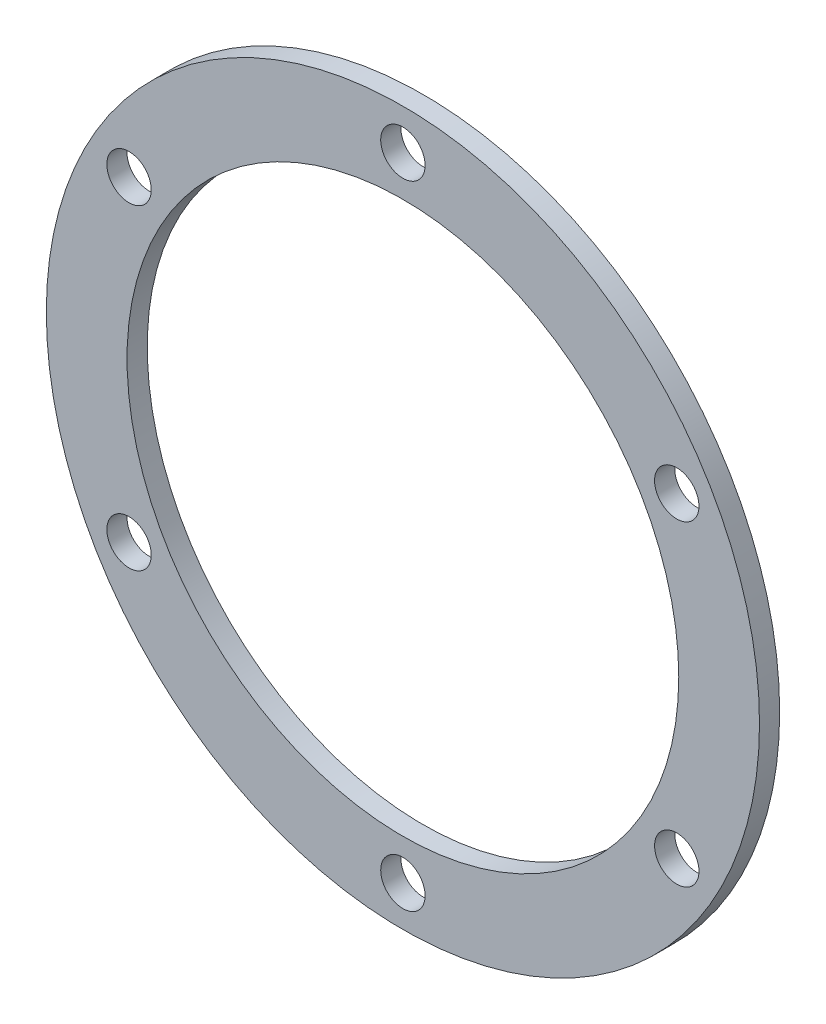
ISO-10303-21;
HEADER;
FILE_DESCRIPTION(('STEP AP214'),'2;1');
FILE_NAME('part.step','',(''),(''),'','','');
FILE_SCHEMA(('AUTOMOTIVE_DESIGN { 1 0 10303 214 1 1 1 1 }'));
ENDSEC;
DATA;
#1=APPLICATION_CONTEXT('core data for automotive mechanical design processes');
#2=APPLICATION_PROTOCOL_DEFINITION('international standard','automotive_design',2000,#1);
#3=PRODUCT_CONTEXT('',#1,'mechanical');
#4=PRODUCT('Part','Part','',(#3));
#5=PRODUCT_RELATED_PRODUCT_CATEGORY('part','',(#4));
#6=PRODUCT_DEFINITION_FORMATION('','',#4);
#7=PRODUCT_DEFINITION_CONTEXT('part definition',#1,'design');
#8=PRODUCT_DEFINITION('design','',#6,#7);
#9=PRODUCT_DEFINITION_SHAPE('','',#8);
#10=(LENGTH_UNIT() NAMED_UNIT(*) SI_UNIT(.MILLI.,.METRE.));
#11=(NAMED_UNIT(*) PLANE_ANGLE_UNIT() SI_UNIT($,.RADIAN.));
#12=(NAMED_UNIT(*) SI_UNIT($,.STERADIAN.) SOLID_ANGLE_UNIT());
#13=UNCERTAINTY_MEASURE_WITH_UNIT(LENGTH_MEASURE(1.E-05),#10,'distance_accuracy_value','');
#14=(GEOMETRIC_REPRESENTATION_CONTEXT(3) GLOBAL_UNCERTAINTY_ASSIGNED_CONTEXT((#13)) GLOBAL_UNIT_ASSIGNED_CONTEXT((#10,
#11,#12)) REPRESENTATION_CONTEXT('',''));
#15=CARTESIAN_POINT('',(0.,0.,0.));
#16=DIRECTION('',(0.,0.,1.));
#17=DIRECTION('',(1.,0.,0.));
#18=AXIS2_PLACEMENT_3D('',#15,#16,#17);
#19=CARTESIAN_POINT('',(0.,0.,1.5));
#20=DIRECTION('',(0.,0.,1.));
#21=DIRECTION('',(1.,0.,0.));
#22=AXIS2_PLACEMENT_3D('',#19,#20,#21);
#23=PLANE('',#22);
#24=CARTESIAN_POINT('',(20.3515969889342,11.7500000000002,1.5));
#25=DIRECTION('',(0.,0.,1.));
#26=DIRECTION('',(0.50000000000001,-0.866025403784433,0.));
#27=AXIS2_PLACEMENT_3D('',#24,#25,#26);
#28=CIRCLE('',#27,1.65);
#29=CARTESIAN_POINT('',(21.1765969889342,10.3210580837559,1.5));
#30=VERTEX_POINT('',#29);
#31=EDGE_CURVE('E65',#30,#30,#28,.T.);
#32=ORIENTED_EDGE('',*,*,#31,.F.);
#33=EDGE_LOOP('',(#32));
#34=FACE_BOUND('',#33,.T.);
#35=CARTESIAN_POINT('',(20.3515969889344,-11.7499999999998,1.5));
#36=DIRECTION('',(0.,0.,1.));
#37=DIRECTION('',(-0.499999999999992,-0.866025403784443,0.));
#38=AXIS2_PLACEMENT_3D('',#35,#36,#37);
#39=CIRCLE('',#38,1.65);
#40=CARTESIAN_POINT('',(19.5265969889344,-13.1789419162441,1.5));
#41=VERTEX_POINT('',#40);
#42=EDGE_CURVE('E71',#41,#41,#39,.T.);
#43=ORIENTED_EDGE('',*,*,#42,.F.);
#44=EDGE_LOOP('',(#43));
#45=FACE_BOUND('',#44,.T.);
#46=CARTESIAN_POINT('',(0.,-23.5,1.5));
#47=DIRECTION('',(0.,0.,1.));
#48=DIRECTION('',(-1.,0.,0.));
#49=AXIS2_PLACEMENT_3D('',#46,#47,#48);
#50=CIRCLE('',#49,1.65);
#51=CARTESIAN_POINT('',(-1.65,-23.5,1.5));
#52=VERTEX_POINT('',#51);
#53=EDGE_CURVE('E77',#52,#52,#50,.T.);
#54=ORIENTED_EDGE('',*,*,#53,.F.);
#55=EDGE_LOOP('',(#54));
#56=FACE_BOUND('',#55,.T.);
#57=CARTESIAN_POINT('',(-20.3515969889343,-11.7500000000001,1.5));
#58=DIRECTION('',(0.,0.,1.));
#59=DIRECTION('',(-0.500000000000004,0.866025403784436,0.));
#60=AXIS2_PLACEMENT_3D('',#57,#58,#59);
#61=CIRCLE('',#60,1.65);
#62=CARTESIAN_POINT('',(-21.1765969889343,-10.3210580837558,1.5));
#63=VERTEX_POINT('',#62);
#64=EDGE_CURVE('E83',#63,#63,#61,.T.);
#65=ORIENTED_EDGE('',*,*,#64,.F.);
#66=EDGE_LOOP('',(#65));
#67=FACE_BOUND('',#66,.T.);
#68=CARTESIAN_POINT('',(-20.3515969889343,11.75,1.5));
#69=DIRECTION('',(0.,0.,1.));
#70=DIRECTION('',(0.499999999999998,0.86602540378444,0.));
#71=AXIS2_PLACEMENT_3D('',#68,#69,#70);
#72=CIRCLE('',#71,1.65);
#73=CARTESIAN_POINT('',(-19.5265969889343,13.1789419162443,1.5));
#74=VERTEX_POINT('',#73);
#75=EDGE_CURVE('E59',#74,#74,#72,.T.);
#76=ORIENTED_EDGE('',*,*,#75,.F.);
#77=EDGE_LOOP('',(#76));
#78=FACE_BOUND('',#77,.T.);
#79=CARTESIAN_POINT('',(0.,23.5,1.5));
#80=DIRECTION('',(0.,0.,1.));
#81=DIRECTION('',(1.,0.,0.));
#82=AXIS2_PLACEMENT_3D('',#79,#80,#81);
#83=CIRCLE('',#82,1.65);
#84=CARTESIAN_POINT('',(1.65,23.5,1.5));
#85=VERTEX_POINT('',#84);
#86=EDGE_CURVE('E53',#85,#85,#83,.T.);
#87=ORIENTED_EDGE('',*,*,#86,.F.);
#88=EDGE_LOOP('',(#87));
#89=FACE_BOUND('',#88,.T.);
#90=CARTESIAN_POINT('',(0.,0.,1.5));
#91=DIRECTION('',(0.,0.,1.));
#92=DIRECTION('',(1.,0.,0.));
#93=AXIS2_PLACEMENT_3D('',#90,#91,#92);
#94=CIRCLE('',#93,26.5);
#95=CARTESIAN_POINT('',(26.5,0.,1.5));
#96=VERTEX_POINT('',#95);
#97=EDGE_CURVE('E10',#96,#96,#94,.T.);
#98=ORIENTED_EDGE('',*,*,#97,.T.);
#99=EDGE_LOOP('',(#98));
#100=FACE_BOUND('',#99,.T.);
#101=CARTESIAN_POINT('',(0.,0.,1.5));
#102=DIRECTION('',(0.,0.,1.));
#103=DIRECTION('',(1.,0.,0.));
#104=AXIS2_PLACEMENT_3D('',#101,#102,#103);
#105=CIRCLE('',#104,20.5);
#106=CARTESIAN_POINT('',(20.5,0.,1.5));
#107=VERTEX_POINT('',#106);
#108=EDGE_CURVE('E45',#107,#107,#105,.T.);
#109=ORIENTED_EDGE('',*,*,#108,.F.);
#110=EDGE_LOOP('',(#109));
#111=FACE_BOUND('',#110,.T.);
#112=ADVANCED_FACE('F34',(#34,#45,#56,#67,#78,#89,#100,#111),#23,.T.);
#113=CARTESIAN_POINT('',(0.,0.,0.));
#114=DIRECTION('',(0.,0.,1.));
#115=DIRECTION('',(1.,0.,0.));
#116=AXIS2_PLACEMENT_3D('',#113,#114,#115);
#117=PLANE('',#116);
#118=CARTESIAN_POINT('',(20.3515969889342,11.7500000000002,0.));
#119=DIRECTION('',(0.,0.,1.));
#120=DIRECTION('',(0.50000000000001,-0.866025403784433,0.));
#121=AXIS2_PLACEMENT_3D('',#118,#119,#120);
#122=CIRCLE('',#121,1.65);
#123=CARTESIAN_POINT('',(21.1765969889342,10.3210580837559,0.));
#124=VERTEX_POINT('',#123);
#125=EDGE_CURVE('E68',#124,#124,#122,.T.);
#126=ORIENTED_EDGE('',*,*,#125,.T.);
#127=EDGE_LOOP('',(#126));
#128=FACE_BOUND('',#127,.T.);
#129=CARTESIAN_POINT('',(20.3515969889344,-11.7499999999998,0.));
#130=DIRECTION('',(0.,0.,1.));
#131=DIRECTION('',(-0.499999999999992,-0.866025403784443,0.));
#132=AXIS2_PLACEMENT_3D('',#129,#130,#131);
#133=CIRCLE('',#132,1.65);
#134=CARTESIAN_POINT('',(19.5265969889344,-13.1789419162441,0.));
#135=VERTEX_POINT('',#134);
#136=EDGE_CURVE('E74',#135,#135,#133,.T.);
#137=ORIENTED_EDGE('',*,*,#136,.T.);
#138=EDGE_LOOP('',(#137));
#139=FACE_BOUND('',#138,.T.);
#140=CARTESIAN_POINT('',(0.,-23.5,0.));
#141=DIRECTION('',(0.,0.,1.));
#142=DIRECTION('',(-1.,0.,0.));
#143=AXIS2_PLACEMENT_3D('',#140,#141,#142);
#144=CIRCLE('',#143,1.65);
#145=CARTESIAN_POINT('',(-1.65,-23.5,0.));
#146=VERTEX_POINT('',#145);
#147=EDGE_CURVE('E80',#146,#146,#144,.T.);
#148=ORIENTED_EDGE('',*,*,#147,.T.);
#149=EDGE_LOOP('',(#148));
#150=FACE_BOUND('',#149,.T.);
#151=CARTESIAN_POINT('',(-20.3515969889343,-11.7500000000001,0.));
#152=DIRECTION('',(0.,0.,1.));
#153=DIRECTION('',(-0.500000000000004,0.866025403784436,0.));
#154=AXIS2_PLACEMENT_3D('',#151,#152,#153);
#155=CIRCLE('',#154,1.65);
#156=CARTESIAN_POINT('',(-21.1765969889343,-10.3210580837558,0.));
#157=VERTEX_POINT('',#156);
#158=EDGE_CURVE('E62',#157,#157,#155,.T.);
#159=ORIENTED_EDGE('',*,*,#158,.T.);
#160=EDGE_LOOP('',(#159));
#161=FACE_BOUND('',#160,.T.);
#162=CARTESIAN_POINT('',(-20.3515969889343,11.75,0.));
#163=DIRECTION('',(0.,0.,1.));
#164=DIRECTION('',(0.499999999999998,0.86602540378444,0.));
#165=AXIS2_PLACEMENT_3D('',#162,#163,#164);
#166=CIRCLE('',#165,1.65);
#167=CARTESIAN_POINT('',(-19.5265969889343,13.1789419162443,0.));
#168=VERTEX_POINT('',#167);
#169=EDGE_CURVE('E56',#168,#168,#166,.T.);
#170=ORIENTED_EDGE('',*,*,#169,.T.);
#171=EDGE_LOOP('',(#170));
#172=FACE_BOUND('',#171,.T.);
#173=CARTESIAN_POINT('',(0.,23.5,0.));
#174=DIRECTION('',(0.,0.,1.));
#175=DIRECTION('',(1.,0.,0.));
#176=AXIS2_PLACEMENT_3D('',#173,#174,#175);
#177=CIRCLE('',#176,1.65);
#178=CARTESIAN_POINT('',(1.65,23.5,0.));
#179=VERTEX_POINT('',#178);
#180=EDGE_CURVE('E50',#179,#179,#177,.T.);
#181=ORIENTED_EDGE('',*,*,#180,.T.);
#182=EDGE_LOOP('',(#181));
#183=FACE_BOUND('',#182,.T.);
#184=CARTESIAN_POINT('',(0.,0.,0.));
#185=DIRECTION('',(0.,0.,1.));
#186=DIRECTION('',(1.,0.,0.));
#187=AXIS2_PLACEMENT_3D('',#184,#185,#186);
#188=CIRCLE('',#187,26.5);
#189=CARTESIAN_POINT('',(26.5,0.,0.));
#190=VERTEX_POINT('',#189);
#191=EDGE_CURVE('E38',#190,#190,#188,.T.);
#192=ORIENTED_EDGE('',*,*,#191,.F.);
#193=EDGE_LOOP('',(#192));
#194=FACE_BOUND('',#193,.T.);
#195=CARTESIAN_POINT('',(0.,0.,0.));
#196=DIRECTION('',(0.,0.,1.));
#197=DIRECTION('',(1.,0.,0.));
#198=AXIS2_PLACEMENT_3D('',#195,#196,#197);
#199=CIRCLE('',#198,20.5);
#200=CARTESIAN_POINT('',(20.5,0.,0.));
#201=VERTEX_POINT('',#200);
#202=EDGE_CURVE('E47',#201,#201,#199,.T.);
#203=ORIENTED_EDGE('',*,*,#202,.T.);
#204=EDGE_LOOP('',(#203));
#205=FACE_BOUND('',#204,.T.);
#206=ADVANCED_FACE('F89',(#128,#139,#150,#161,#172,#183,#194,#205),#117,.F.);
#207=CARTESIAN_POINT('',(0.,0.,1.5));
#208=DIRECTION('',(0.,0.,-1.));
#209=DIRECTION('',(-1.,0.,0.));
#210=AXIS2_PLACEMENT_3D('',#207,#208,#209);
#211=CYLINDRICAL_SURFACE('',#210,26.5);
#212=ORIENTED_EDGE('',*,*,#97,.F.);
#213=EDGE_LOOP('',(#212));
#214=FACE_BOUND('',#213,.T.);
#215=ORIENTED_EDGE('',*,*,#191,.T.);
#216=EDGE_LOOP('',(#215));
#217=FACE_BOUND('',#216,.T.);
#218=ADVANCED_FACE('F36',(#214,#217),#211,.T.);
#219=CARTESIAN_POINT('',(0.,0.,1.5));
#220=DIRECTION('',(0.,0.,-1.));
#221=DIRECTION('',(-1.,0.,0.));
#222=AXIS2_PLACEMENT_3D('',#219,#220,#221);
#223=CYLINDRICAL_SURFACE('',#222,20.5);
#224=ORIENTED_EDGE('',*,*,#108,.T.);
#225=EDGE_LOOP('',(#224));
#226=FACE_BOUND('',#225,.T.);
#227=ORIENTED_EDGE('',*,*,#202,.F.);
#228=EDGE_LOOP('',(#227));
#229=FACE_BOUND('',#228,.T.);
#230=ADVANCED_FACE('F110',(#226,#229),#223,.F.);
#231=CARTESIAN_POINT('',(0.,23.5,0.));
#232=DIRECTION('',(0.,0.,1.));
#233=DIRECTION('',(1.,0.,0.));
#234=AXIS2_PLACEMENT_3D('',#231,#232,#233);
#235=CYLINDRICAL_SURFACE('',#234,1.65);
#236=ORIENTED_EDGE('',*,*,#180,.F.);
#237=EDGE_LOOP('',(#236));
#238=FACE_BOUND('',#237,.T.);
#239=ORIENTED_EDGE('',*,*,#86,.T.);
#240=EDGE_LOOP('',(#239));
#241=FACE_BOUND('',#240,.T.);
#242=ADVANCED_FACE('F113',(#238,#241),#235,.F.);
#243=CARTESIAN_POINT('',(-20.3515969889343,11.75,0.));
#244=DIRECTION('',(0.,0.,1.));
#245=DIRECTION('',(1.,0.,0.));
#246=AXIS2_PLACEMENT_3D('',#243,#244,#245);
#247=CYLINDRICAL_SURFACE('',#246,1.65);
#248=ORIENTED_EDGE('',*,*,#169,.F.);
#249=EDGE_LOOP('',(#248));
#250=FACE_BOUND('',#249,.T.);
#251=ORIENTED_EDGE('',*,*,#75,.T.);
#252=EDGE_LOOP('',(#251));
#253=FACE_BOUND('',#252,.T.);
#254=ADVANCED_FACE('F96',(#250,#253),#247,.F.);
#255=CARTESIAN_POINT('',(-20.3515969889343,-11.7500000000001,0.));
#256=DIRECTION('',(0.,0.,1.));
#257=DIRECTION('',(1.,0.,0.));
#258=AXIS2_PLACEMENT_3D('',#255,#256,#257);
#259=CYLINDRICAL_SURFACE('',#258,1.65);
#260=ORIENTED_EDGE('',*,*,#158,.F.);
#261=EDGE_LOOP('',(#260));
#262=FACE_BOUND('',#261,.T.);
#263=ORIENTED_EDGE('',*,*,#64,.T.);
#264=EDGE_LOOP('',(#263));
#265=FACE_BOUND('',#264,.T.);
#266=ADVANCED_FACE('F92',(#262,#265),#259,.F.);
#267=CARTESIAN_POINT('',(0.,-23.5,0.));
#268=DIRECTION('',(0.,0.,1.));
#269=DIRECTION('',(1.,0.,0.));
#270=AXIS2_PLACEMENT_3D('',#267,#268,#269);
#271=CYLINDRICAL_SURFACE('',#270,1.65);
#272=ORIENTED_EDGE('',*,*,#147,.F.);
#273=EDGE_LOOP('',(#272));
#274=FACE_BOUND('',#273,.T.);
#275=ORIENTED_EDGE('',*,*,#53,.T.);
#276=EDGE_LOOP('',(#275));
#277=FACE_BOUND('',#276,.T.);
#278=ADVANCED_FACE('F95',(#274,#277),#271,.F.);
#279=CARTESIAN_POINT('',(20.3515969889344,-11.7499999999998,0.));
#280=DIRECTION('',(0.,0.,1.));
#281=DIRECTION('',(1.,0.,0.));
#282=AXIS2_PLACEMENT_3D('',#279,#280,#281);
#283=CYLINDRICAL_SURFACE('',#282,1.65);
#284=ORIENTED_EDGE('',*,*,#136,.F.);
#285=EDGE_LOOP('',(#284));
#286=FACE_BOUND('',#285,.T.);
#287=ORIENTED_EDGE('',*,*,#42,.T.);
#288=EDGE_LOOP('',(#287));
#289=FACE_BOUND('',#288,.T.);
#290=ADVANCED_FACE('F134',(#286,#289),#283,.F.);
#291=CARTESIAN_POINT('',(20.3515969889342,11.7500000000002,0.));
#292=DIRECTION('',(0.,0.,1.));
#293=DIRECTION('',(1.,0.,0.));
#294=AXIS2_PLACEMENT_3D('',#291,#292,#293);
#295=CYLINDRICAL_SURFACE('',#294,1.65);
#296=ORIENTED_EDGE('',*,*,#125,.F.);
#297=EDGE_LOOP('',(#296));
#298=FACE_BOUND('',#297,.T.);
#299=ORIENTED_EDGE('',*,*,#31,.T.);
#300=EDGE_LOOP('',(#299));
#301=FACE_BOUND('',#300,.T.);
#302=ADVANCED_FACE('F131',(#298,#301),#295,.F.);
#303=CLOSED_SHELL('',(#112,#206,#218,#230,#242,#254,#266,#278,#290,#302));
#304=MANIFOLD_SOLID_BREP('B2',#303);
#305=ADVANCED_BREP_SHAPE_REPRESENTATION('',(#18,#304),#14);
#306=SHAPE_DEFINITION_REPRESENTATION(#9,#305);
ENDSEC;
END-ISO-10303-21;
